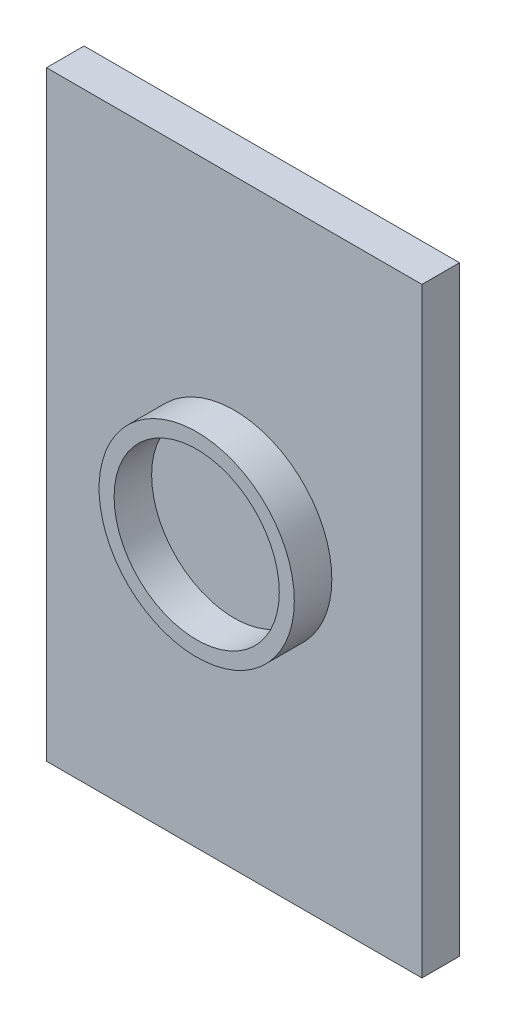
ISO-10303-21;
HEADER;
FILE_DESCRIPTION(('STEP AP214'),'2;1');
FILE_NAME('part.step','',(''),(''),'','','');
FILE_SCHEMA(('AUTOMOTIVE_DESIGN { 1 0 10303 214 1 1 1 1 }'));
ENDSEC;
DATA;
#1=APPLICATION_CONTEXT('core data for automotive mechanical design processes');
#2=APPLICATION_PROTOCOL_DEFINITION('international standard','automotive_design',2000,#1);
#3=PRODUCT_CONTEXT('',#1,'mechanical');
#4=PRODUCT('Part','Part','',(#3));
#5=PRODUCT_RELATED_PRODUCT_CATEGORY('part','',(#4));
#6=PRODUCT_DEFINITION_FORMATION('','',#4);
#7=PRODUCT_DEFINITION_CONTEXT('part definition',#1,'design');
#8=PRODUCT_DEFINITION('design','',#6,#7);
#9=PRODUCT_DEFINITION_SHAPE('','',#8);
#10=(LENGTH_UNIT() NAMED_UNIT(*) SI_UNIT(.MILLI.,.METRE.));
#11=(NAMED_UNIT(*) PLANE_ANGLE_UNIT() SI_UNIT($,.RADIAN.));
#12=(NAMED_UNIT(*) SI_UNIT($,.STERADIAN.) SOLID_ANGLE_UNIT());
#13=UNCERTAINTY_MEASURE_WITH_UNIT(LENGTH_MEASURE(1.E-05),#10,'distance_accuracy_value','');
#14=(GEOMETRIC_REPRESENTATION_CONTEXT(3) GLOBAL_UNCERTAINTY_ASSIGNED_CONTEXT((#13)) GLOBAL_UNIT_ASSIGNED_CONTEXT((#10,
#11,#12)) REPRESENTATION_CONTEXT('',''));
#15=CARTESIAN_POINT('',(0.,0.,0.));
#16=DIRECTION('',(0.,0.,1.));
#17=DIRECTION('',(1.,0.,0.));
#18=AXIS2_PLACEMENT_3D('',#15,#16,#17);
#19=CARTESIAN_POINT('',(25.,40.,5.));
#20=DIRECTION('',(-1.,0.,0.));
#21=DIRECTION('',(0.,-1.,0.));
#22=AXIS2_PLACEMENT_3D('',#19,#20,#21);
#23=PLANE('',#22);
#24=DIRECTION('',(0.,1.,0.));
#25=VECTOR('',#24,1.);
#26=CARTESIAN_POINT('',(25.,40.,0.));
#27=LINE('',#26,#25);
#28=CARTESIAN_POINT('',(25.,-40.,0.));
#29=VERTEX_POINT('',#28);
#30=CARTESIAN_POINT('',(25.,40.,0.));
#31=VERTEX_POINT('',#30);
#32=EDGE_CURVE('E99',#29,#31,#27,.T.);
#33=ORIENTED_EDGE('',*,*,#32,.T.);
#34=DIRECTION('',(0.,0.,-1.));
#35=VECTOR('',#34,1.);
#36=CARTESIAN_POINT('',(25.,40.,5.));
#37=LINE('',#36,#35);
#38=CARTESIAN_POINT('',(25.,40.,5.));
#39=VERTEX_POINT('',#38);
#40=EDGE_CURVE('E41',#39,#31,#37,.T.);
#41=ORIENTED_EDGE('',*,*,#40,.F.);
#42=DIRECTION('',(0.,1.,0.));
#43=VECTOR('',#42,1.);
#44=CARTESIAN_POINT('',(25.,40.,5.));
#45=LINE('',#44,#43);
#46=CARTESIAN_POINT('',(25.,-40.,5.));
#47=VERTEX_POINT('',#46);
#48=EDGE_CURVE('E85',#47,#39,#45,.T.);
#49=ORIENTED_EDGE('',*,*,#48,.F.);
#50=DIRECTION('',(0.,0.,-1.));
#51=VECTOR('',#50,1.);
#52=CARTESIAN_POINT('',(25.,-40.,5.));
#53=LINE('',#52,#51);
#54=EDGE_CURVE('E95',#47,#29,#53,.T.);
#55=ORIENTED_EDGE('',*,*,#54,.T.);
#56=EDGE_LOOP('',(#33,#41,#49,#55));
#57=FACE_BOUND('',#56,.T.);
#58=ADVANCED_FACE('F33',(#57),#23,.F.);
#59=CARTESIAN_POINT('',(-25.,40.,5.));
#60=DIRECTION('',(0.,-1.,0.));
#61=DIRECTION('',(0.,0.,-1.));
#62=AXIS2_PLACEMENT_3D('',#59,#60,#61);
#63=PLANE('',#62);
#64=DIRECTION('',(-1.,0.,0.));
#65=VECTOR('',#64,1.);
#66=CARTESIAN_POINT('',(-25.,40.,0.));
#67=LINE('',#66,#65);
#68=CARTESIAN_POINT('',(-25.,40.,0.));
#69=VERTEX_POINT('',#68);
#70=EDGE_CURVE('E90',#31,#69,#67,.T.);
#71=ORIENTED_EDGE('',*,*,#70,.T.);
#72=DIRECTION('',(0.,0.,-1.));
#73=VECTOR('',#72,1.);
#74=CARTESIAN_POINT('',(-25.,40.,5.));
#75=LINE('',#74,#73);
#76=CARTESIAN_POINT('',(-25.,40.,5.));
#77=VERTEX_POINT('',#76);
#78=EDGE_CURVE('E88',#77,#69,#75,.T.);
#79=ORIENTED_EDGE('',*,*,#78,.F.);
#80=DIRECTION('',(-1.,0.,0.));
#81=VECTOR('',#80,1.);
#82=CARTESIAN_POINT('',(-25.,40.,5.));
#83=LINE('',#82,#81);
#84=EDGE_CURVE('E80',#39,#77,#83,.T.);
#85=ORIENTED_EDGE('',*,*,#84,.F.);
#86=ORIENTED_EDGE('',*,*,#40,.T.);
#87=EDGE_LOOP('',(#71,#79,#85,#86));
#88=FACE_BOUND('',#87,.T.);
#89=ADVANCED_FACE('F89',(#88),#63,.F.);
#90=CARTESIAN_POINT('',(-25.,40.,5.));
#91=DIRECTION('',(1.,0.,0.));
#92=DIRECTION('',(0.,1.,0.));
#93=AXIS2_PLACEMENT_3D('',#90,#91,#92);
#94=PLANE('',#93);
#95=DIRECTION('',(0.,-1.,0.));
#96=VECTOR('',#95,1.);
#97=CARTESIAN_POINT('',(-25.,40.,0.));
#98=LINE('',#97,#96);
#99=CARTESIAN_POINT('',(-25.,-40.,0.));
#100=VERTEX_POINT('',#99);
#101=EDGE_CURVE('E66',#69,#100,#98,.T.);
#102=ORIENTED_EDGE('',*,*,#101,.T.);
#103=DIRECTION('',(0.,0.,-1.));
#104=VECTOR('',#103,1.);
#105=CARTESIAN_POINT('',(-25.,-40.,5.));
#106=LINE('',#105,#104);
#107=CARTESIAN_POINT('',(-25.,-40.,5.));
#108=VERTEX_POINT('',#107);
#109=EDGE_CURVE('E91',#108,#100,#106,.T.);
#110=ORIENTED_EDGE('',*,*,#109,.F.);
#111=DIRECTION('',(0.,-1.,0.));
#112=VECTOR('',#111,1.);
#113=CARTESIAN_POINT('',(-25.,40.,5.));
#114=LINE('',#113,#112);
#115=EDGE_CURVE('E83',#77,#108,#114,.T.);
#116=ORIENTED_EDGE('',*,*,#115,.F.);
#117=ORIENTED_EDGE('',*,*,#78,.T.);
#118=EDGE_LOOP('',(#102,#110,#116,#117));
#119=FACE_BOUND('',#118,.T.);
#120=ADVANCED_FACE('F93',(#119),#94,.F.);
#121=CARTESIAN_POINT('',(-25.,-40.,5.));
#122=DIRECTION('',(0.,1.,0.));
#123=DIRECTION('',(0.,0.,1.));
#124=AXIS2_PLACEMENT_3D('',#121,#122,#123);
#125=PLANE('',#124);
#126=DIRECTION('',(1.,0.,0.));
#127=VECTOR('',#126,1.);
#128=CARTESIAN_POINT('',(-25.,-40.,0.));
#129=LINE('',#128,#127);
#130=EDGE_CURVE('E72',#100,#29,#129,.T.);
#131=ORIENTED_EDGE('',*,*,#130,.T.);
#132=ORIENTED_EDGE('',*,*,#54,.F.);
#133=DIRECTION('',(1.,0.,0.));
#134=VECTOR('',#133,1.);
#135=CARTESIAN_POINT('',(-25.,-40.,5.));
#136=LINE('',#135,#134);
#137=EDGE_CURVE('E49',#108,#47,#136,.T.);
#138=ORIENTED_EDGE('',*,*,#137,.F.);
#139=ORIENTED_EDGE('',*,*,#109,.T.);
#140=EDGE_LOOP('',(#131,#132,#138,#139));
#141=FACE_BOUND('',#140,.T.);
#142=ADVANCED_FACE('F121',(#141),#125,.F.);
#143=CARTESIAN_POINT('',(0.,0.,5.));
#144=DIRECTION('',(0.,0.,1.));
#145=DIRECTION('',(1.,0.,0.));
#146=AXIS2_PLACEMENT_3D('',#143,#144,#145);
#147=PLANE('',#146);
#148=CARTESIAN_POINT('',(0.,0.,5.));
#149=DIRECTION('',(0.,0.,1.));
#150=DIRECTION('',(1.,0.,0.));
#151=AXIS2_PLACEMENT_3D('',#148,#149,#150);
#152=CIRCLE('',#151,13.);
#153=CARTESIAN_POINT('',(13.,0.,5.));
#154=VERTEX_POINT('',#153);
#155=EDGE_CURVE('E190',#154,#154,#152,.T.);
#156=ORIENTED_EDGE('',*,*,#155,.F.);
#157=EDGE_LOOP('',(#156));
#158=FACE_BOUND('',#157,.T.);
#159=ORIENTED_EDGE('',*,*,#48,.T.);
#160=ORIENTED_EDGE('',*,*,#84,.T.);
#161=ORIENTED_EDGE('',*,*,#115,.T.);
#162=ORIENTED_EDGE('',*,*,#137,.T.);
#163=EDGE_LOOP('',(#159,#160,#161,#162));
#164=FACE_BOUND('',#163,.T.);
#165=ADVANCED_FACE('F81',(#158,#164),#147,.T.);
#166=CARTESIAN_POINT('',(0.,0.,0.));
#167=DIRECTION('',(0.,0.,1.));
#168=DIRECTION('',(1.,0.,0.));
#169=AXIS2_PLACEMENT_3D('',#166,#167,#168);
#170=PLANE('',#169);
#171=ORIENTED_EDGE('',*,*,#32,.F.);
#172=ORIENTED_EDGE('',*,*,#130,.F.);
#173=ORIENTED_EDGE('',*,*,#101,.F.);
#174=ORIENTED_EDGE('',*,*,#70,.F.);
#175=EDGE_LOOP('',(#171,#172,#173,#174));
#176=FACE_BOUND('',#175,.T.);
#177=ADVANCED_FACE('F110',(#176),#170,.F.);
#178=CARTESIAN_POINT('',(0.,0.,10.));
#179=DIRECTION('',(0.,0.,1.));
#180=DIRECTION('',(1.,0.,0.));
#181=AXIS2_PLACEMENT_3D('',#178,#179,#180);
#182=PLANE('',#181);
#183=CARTESIAN_POINT('',(0.,0.,10.));
#184=DIRECTION('',(0.,0.,1.));
#185=DIRECTION('',(1.,0.,0.));
#186=AXIS2_PLACEMENT_3D('',#183,#184,#185);
#187=CIRCLE('',#186,13.);
#188=CARTESIAN_POINT('',(13.,0.,10.));
#189=VERTEX_POINT('',#188);
#190=EDGE_CURVE('E102',#189,#189,#187,.T.);
#191=ORIENTED_EDGE('',*,*,#190,.T.);
#192=EDGE_LOOP('',(#191));
#193=FACE_BOUND('',#192,.T.);
#194=CARTESIAN_POINT('',(0.,0.,10.));
#195=DIRECTION('',(0.,0.,1.));
#196=DIRECTION('',(1.,0.,0.));
#197=AXIS2_PLACEMENT_3D('',#194,#195,#196);
#198=CIRCLE('',#197,11.);
#199=CARTESIAN_POINT('',(11.,0.,10.));
#200=VERTEX_POINT('',#199);
#201=EDGE_CURVE('E188',#200,#200,#198,.T.);
#202=ORIENTED_EDGE('',*,*,#201,.F.);
#203=EDGE_LOOP('',(#202));
#204=FACE_BOUND('',#203,.T.);
#205=ADVANCED_FACE('F112',(#193,#204),#182,.T.);
#206=CARTESIAN_POINT('',(0.,0.,10.));
#207=DIRECTION('',(0.,0.,-1.));
#208=DIRECTION('',(-1.,0.,0.));
#209=AXIS2_PLACEMENT_3D('',#206,#207,#208);
#210=CYLINDRICAL_SURFACE('',#209,13.);
#211=ORIENTED_EDGE('',*,*,#190,.F.);
#212=EDGE_LOOP('',(#211));
#213=FACE_BOUND('',#212,.T.);
#214=ORIENTED_EDGE('',*,*,#155,.T.);
#215=EDGE_LOOP('',(#214));
#216=FACE_BOUND('',#215,.T.);
#217=ADVANCED_FACE('F118',(#213,#216),#210,.T.);
#218=CARTESIAN_POINT('',(0.,0.,10.));
#219=DIRECTION('',(0.,0.,-1.));
#220=DIRECTION('',(-1.,0.,0.));
#221=AXIS2_PLACEMENT_3D('',#218,#219,#220);
#222=CYLINDRICAL_SURFACE('',#221,11.);
#223=ORIENTED_EDGE('',*,*,#201,.T.);
#224=EDGE_LOOP('',(#223));
#225=FACE_BOUND('',#224,.T.);
#226=CARTESIAN_POINT('',(0.,0.,5.));
#227=DIRECTION('',(0.,0.,1.));
#228=DIRECTION('',(1.,0.,0.));
#229=AXIS2_PLACEMENT_3D('',#226,#227,#228);
#230=CIRCLE('',#229,11.);
#231=CARTESIAN_POINT('',(11.,0.,5.));
#232=VERTEX_POINT('',#231);
#233=EDGE_CURVE('E11',#232,#232,#230,.F.);
#234=ORIENTED_EDGE('',*,*,#233,.T.);
#235=EDGE_LOOP('',(#234));
#236=FACE_BOUND('',#235,.T.);
#237=ADVANCED_FACE('F161',(#225,#236),#222,.F.);
#238=ORIENTED_EDGE('',*,*,#233,.F.);
#239=EDGE_LOOP('',(#238));
#240=FACE_BOUND('',#239,.T.);
#241=ADVANCED_FACE('F124',(#240),#147,.T.);
#242=CLOSED_SHELL('',(#58,#89,#120,#142,#165,#177,#205,#217,#237,#241));
#243=MANIFOLD_SOLID_BREP('B2',#242);
#244=ADVANCED_BREP_SHAPE_REPRESENTATION('',(#18,#243),#14);
#245=SHAPE_DEFINITION_REPRESENTATION(#9,#244);
ENDSEC;
END-ISO-10303-21;
